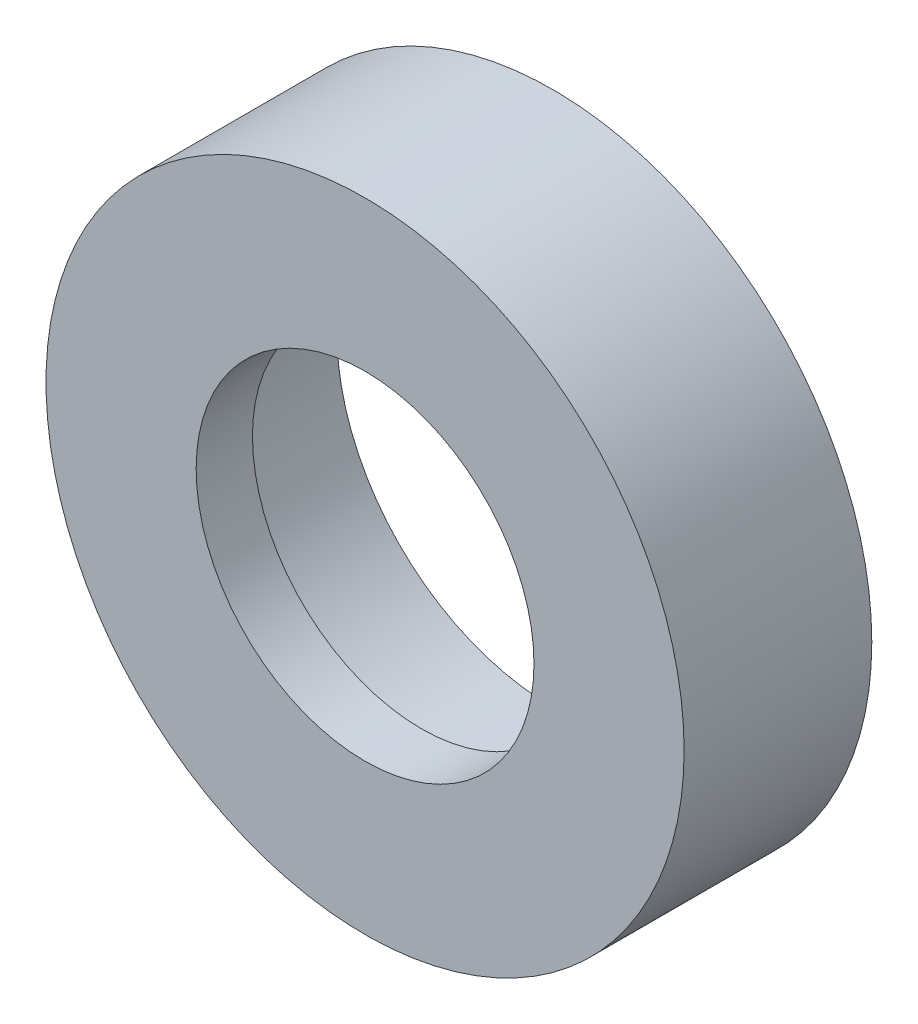
ISO-10303-21;
HEADER;
FILE_DESCRIPTION(('STEP AP214'),'2;1');
FILE_NAME('part.step','',(''),(''),'','','');
FILE_SCHEMA(('AUTOMOTIVE_DESIGN { 1 0 10303 214 1 1 1 1 }'));
ENDSEC;
DATA;
#1=APPLICATION_CONTEXT('core data for automotive mechanical design processes');
#2=APPLICATION_PROTOCOL_DEFINITION('international standard','automotive_design',2000,#1);
#3=PRODUCT_CONTEXT('',#1,'mechanical');
#4=PRODUCT('Part','Part','',(#3));
#5=PRODUCT_RELATED_PRODUCT_CATEGORY('part','',(#4));
#6=PRODUCT_DEFINITION_FORMATION('','',#4);
#7=PRODUCT_DEFINITION_CONTEXT('part definition',#1,'design');
#8=PRODUCT_DEFINITION('design','',#6,#7);
#9=PRODUCT_DEFINITION_SHAPE('','',#8);
#10=(LENGTH_UNIT() NAMED_UNIT(*) SI_UNIT(.MILLI.,.METRE.));
#11=(NAMED_UNIT(*) PLANE_ANGLE_UNIT() SI_UNIT($,.RADIAN.));
#12=(NAMED_UNIT(*) SI_UNIT($,.STERADIAN.) SOLID_ANGLE_UNIT());
#13=UNCERTAINTY_MEASURE_WITH_UNIT(LENGTH_MEASURE(1.E-05),#10,'distance_accuracy_value','');
#14=(GEOMETRIC_REPRESENTATION_CONTEXT(3) GLOBAL_UNCERTAINTY_ASSIGNED_CONTEXT((#13)) GLOBAL_UNIT_ASSIGNED_CONTEXT((#10,
#11,#12)) REPRESENTATION_CONTEXT('',''));
#15=CARTESIAN_POINT('',(0.,0.,0.));
#16=DIRECTION('',(0.,0.,1.));
#17=DIRECTION('',(1.,0.,0.));
#18=AXIS2_PLACEMENT_3D('',#15,#16,#17);
#19=CARTESIAN_POINT('',(0.,0.,10.));
#20=DIRECTION('',(0.,0.,-1.));
#21=DIRECTION('',(-1.,0.,0.));
#22=AXIS2_PLACEMENT_3D('',#19,#20,#21);
#23=CYLINDRICAL_SURFACE('',#22,11.5);
#24=CARTESIAN_POINT('',(0.,0.,0.));
#25=DIRECTION('',(0.,0.,1.));
#26=DIRECTION('',(1.,0.,0.));
#27=AXIS2_PLACEMENT_3D('',#24,#25,#26);
#28=CIRCLE('',#27,11.5);
#29=CARTESIAN_POINT('',(11.5,0.,0.));
#30=VERTEX_POINT('',#29);
#31=EDGE_CURVE('E42',#30,#30,#28,.T.);
#32=ORIENTED_EDGE('',*,*,#31,.F.);
#33=EDGE_LOOP('',(#32));
#34=FACE_BOUND('',#33,.T.);
#35=CARTESIAN_POINT('',(0.,0.,7.));
#36=DIRECTION('',(0.,0.,1.));
#37=DIRECTION('',(1.,0.,0.));
#38=AXIS2_PLACEMENT_3D('',#35,#36,#37);
#39=CIRCLE('',#38,11.5);
#40=CARTESIAN_POINT('',(11.5,0.,7.));
#41=VERTEX_POINT('',#40);
#42=EDGE_CURVE('E46',#41,#41,#39,.T.);
#43=ORIENTED_EDGE('',*,*,#42,.T.);
#44=EDGE_LOOP('',(#43));
#45=FACE_BOUND('',#44,.T.);
#46=ADVANCED_FACE('F31',(#34,#45),#23,.F.);
#47=CARTESIAN_POINT('',(0.,0.,10.));
#48=DIRECTION('',(0.,0.,1.));
#49=DIRECTION('',(1.,0.,0.));
#50=AXIS2_PLACEMENT_3D('',#47,#48,#49);
#51=PLANE('',#50);
#52=CARTESIAN_POINT('',(0.,0.,10.));
#53=DIRECTION('',(0.,0.,1.));
#54=DIRECTION('',(1.,0.,0.));
#55=AXIS2_PLACEMENT_3D('',#52,#53,#54);
#56=CIRCLE('',#55,17.);
#57=CARTESIAN_POINT('',(17.,0.,10.));
#58=VERTEX_POINT('',#57);
#59=EDGE_CURVE('E10',#58,#58,#56,.T.);
#60=ORIENTED_EDGE('',*,*,#59,.T.);
#61=EDGE_LOOP('',(#60));
#62=FACE_BOUND('',#61,.T.);
#63=CARTESIAN_POINT('',(0.,0.,10.));
#64=DIRECTION('',(0.,0.,1.));
#65=DIRECTION('',(1.,0.,0.));
#66=AXIS2_PLACEMENT_3D('',#63,#64,#65);
#67=CIRCLE('',#66,9.);
#68=CARTESIAN_POINT('',(9.,0.,10.));
#69=VERTEX_POINT('',#68);
#70=EDGE_CURVE('E50',#69,#69,#67,.T.);
#71=ORIENTED_EDGE('',*,*,#70,.F.);
#72=EDGE_LOOP('',(#71));
#73=FACE_BOUND('',#72,.T.);
#74=ADVANCED_FACE('F65',(#62,#73),#51,.T.);
#75=CARTESIAN_POINT('',(0.,0.,0.));
#76=DIRECTION('',(0.,0.,1.));
#77=DIRECTION('',(1.,0.,0.));
#78=AXIS2_PLACEMENT_3D('',#75,#76,#77);
#79=PLANE('',#78);
#80=CARTESIAN_POINT('',(0.,0.,0.));
#81=DIRECTION('',(0.,0.,1.));
#82=DIRECTION('',(1.,0.,0.));
#83=AXIS2_PLACEMENT_3D('',#80,#81,#82);
#84=CIRCLE('',#83,17.);
#85=CARTESIAN_POINT('',(17.,0.,0.));
#86=VERTEX_POINT('',#85);
#87=EDGE_CURVE('E35',#86,#86,#84,.T.);
#88=ORIENTED_EDGE('',*,*,#87,.F.);
#89=EDGE_LOOP('',(#88));
#90=FACE_BOUND('',#89,.T.);
#91=ORIENTED_EDGE('',*,*,#31,.T.);
#92=EDGE_LOOP('',(#91));
#93=FACE_BOUND('',#92,.T.);
#94=ADVANCED_FACE('F67',(#90,#93),#79,.F.);
#95=CARTESIAN_POINT('',(0.,0.,10.));
#96=DIRECTION('',(0.,0.,-1.));
#97=DIRECTION('',(-1.,0.,0.));
#98=AXIS2_PLACEMENT_3D('',#95,#96,#97);
#99=CYLINDRICAL_SURFACE('',#98,17.);
#100=ORIENTED_EDGE('',*,*,#59,.F.);
#101=EDGE_LOOP('',(#100));
#102=FACE_BOUND('',#101,.T.);
#103=ORIENTED_EDGE('',*,*,#87,.T.);
#104=EDGE_LOOP('',(#103));
#105=FACE_BOUND('',#104,.T.);
#106=ADVANCED_FACE('F33',(#102,#105),#99,.T.);
#107=CARTESIAN_POINT('',(0.,0.,7.));
#108=DIRECTION('',(0.,0.,1.));
#109=DIRECTION('',(1.,0.,0.));
#110=AXIS2_PLACEMENT_3D('',#107,#108,#109);
#111=PLANE('',#110);
#112=CARTESIAN_POINT('',(0.,0.,7.));
#113=DIRECTION('',(0.,0.,1.));
#114=DIRECTION('',(1.,0.,0.));
#115=AXIS2_PLACEMENT_3D('',#112,#113,#114);
#116=CIRCLE('',#115,9.);
#117=CARTESIAN_POINT('',(9.,0.,7.));
#118=VERTEX_POINT('',#117);
#119=EDGE_CURVE('E49',#118,#118,#116,.T.);
#120=ORIENTED_EDGE('',*,*,#119,.T.);
#121=EDGE_LOOP('',(#120));
#122=FACE_BOUND('',#121,.T.);
#123=ORIENTED_EDGE('',*,*,#42,.F.);
#124=EDGE_LOOP('',(#123));
#125=FACE_BOUND('',#124,.T.);
#126=ADVANCED_FACE('F56',(#122,#125),#111,.F.);
#127=CARTESIAN_POINT('',(0.,0.,7.));
#128=DIRECTION('',(0.,0.,1.));
#129=DIRECTION('',(1.,0.,0.));
#130=AXIS2_PLACEMENT_3D('',#127,#128,#129);
#131=CYLINDRICAL_SURFACE('',#130,9.);
#132=ORIENTED_EDGE('',*,*,#119,.F.);
#133=EDGE_LOOP('',(#132));
#134=FACE_BOUND('',#133,.T.);
#135=ORIENTED_EDGE('',*,*,#70,.T.);
#136=EDGE_LOOP('',(#135));
#137=FACE_BOUND('',#136,.T.);
#138=ADVANCED_FACE('F59',(#134,#137),#131,.F.);
#139=CLOSED_SHELL('',(#46,#74,#94,#106,#126,#138));
#140=MANIFOLD_SOLID_BREP('B2',#139);
#141=ADVANCED_BREP_SHAPE_REPRESENTATION('',(#18,#140),#14);
#142=SHAPE_DEFINITION_REPRESENTATION(#9,#141);
ENDSEC;
END-ISO-10303-21;
